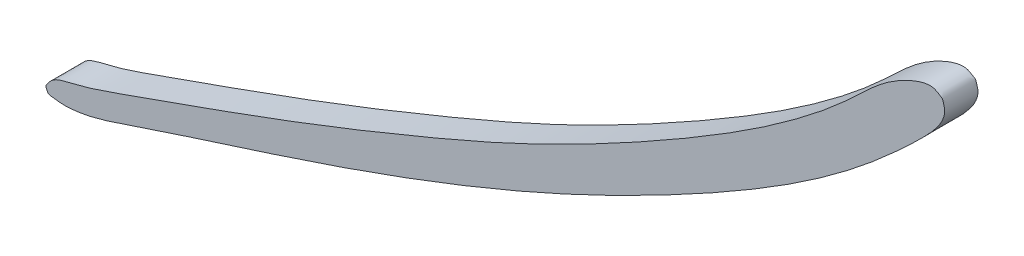
ISO-10303-21;
HEADER;
FILE_DESCRIPTION(('STEP AP214'),'2;1');
FILE_NAME('part.step','',(''),(''),'','','');
FILE_SCHEMA(('AUTOMOTIVE_DESIGN { 1 0 10303 214 1 1 1 1 }'));
ENDSEC;
DATA;
#1=APPLICATION_CONTEXT('core data for automotive mechanical design processes');
#2=APPLICATION_PROTOCOL_DEFINITION('international standard','automotive_design',2000,#1);
#3=PRODUCT_CONTEXT('',#1,'mechanical');
#4=PRODUCT('Part','Part','',(#3));
#5=PRODUCT_RELATED_PRODUCT_CATEGORY('part','',(#4));
#6=PRODUCT_DEFINITION_FORMATION('','',#4);
#7=PRODUCT_DEFINITION_CONTEXT('part definition',#1,'design');
#8=PRODUCT_DEFINITION('design','',#6,#7);
#9=PRODUCT_DEFINITION_SHAPE('','',#8);
#10=(LENGTH_UNIT() NAMED_UNIT(*) SI_UNIT(.MILLI.,.METRE.));
#11=(NAMED_UNIT(*) PLANE_ANGLE_UNIT() SI_UNIT($,.RADIAN.));
#12=(NAMED_UNIT(*) SI_UNIT($,.STERADIAN.) SOLID_ANGLE_UNIT());
#13=UNCERTAINTY_MEASURE_WITH_UNIT(LENGTH_MEASURE(1.E-05),#10,'distance_accuracy_value','');
#14=(GEOMETRIC_REPRESENTATION_CONTEXT(3) GLOBAL_UNCERTAINTY_ASSIGNED_CONTEXT((#13)) GLOBAL_UNIT_ASSIGNED_CONTEXT((#10,
#11,#12)) REPRESENTATION_CONTEXT('',''));
#15=CARTESIAN_POINT('',(0.,0.,0.));
#16=DIRECTION('',(0.,0.,1.));
#17=DIRECTION('',(1.,0.,0.));
#18=AXIS2_PLACEMENT_3D('',#15,#16,#17);
#19=CARTESIAN_POINT('',(101.888371417105,0.,148.));
#20=CARTESIAN_POINT('',(101.799799045957,0.136368437226454,148.));
#21=CARTESIAN_POINT('',(101.66803920609,0.231338491147924,148.));
#22=CARTESIAN_POINT('',(101.398117662418,0.404693908223681,148.));
#23=CARTESIAN_POINT('',(101.25798362386,0.482688788777403,148.));
#24=CARTESIAN_POINT('',(100.981235886567,0.644587099890132,148.));
#25=CARTESIAN_POINT('',(100.844389516816,0.728100014648792,148.));
#26=CARTESIAN_POINT('',(100.564828376442,0.885276300722039,148.));
#27=CARTESIAN_POINT('',(100.422310398472,0.958994361349454,148.));
#28=CARTESIAN_POINT('',(100.132781935363,1.09180106367416,148.));
#29=CARTESIAN_POINT('',(99.98541608821,1.15094079101418,148.));
#30=CARTESIAN_POINT('',(99.6807748753771,1.24155320108028,148.));
#31=CARTESIAN_POINT('',(99.5226184622509,1.27356356744469,148.));
#32=CARTESIAN_POINT('',(99.0425686585769,1.33364432656692,148.));
#33=CARTESIAN_POINT('',(98.7242209946714,1.3259051879344,148.));
#34=CARTESIAN_POINT('',(98.089199896991,1.26295457954378,148.));
#35=CARTESIAN_POINT('',(97.7717321772709,1.20640452707839,148.));
#36=CARTESIAN_POINT('',(97.1488247630582,1.07038752269426,148.));
#37=CARTESIAN_POINT('',(96.8415861500145,0.990306513611557,148.));
#38=CARTESIAN_POINT('',(95.9311932630367,0.717633268708795,148.));
#39=CARTESIAN_POINT('',(95.3386637582218,0.494610490534032,148.));
#40=CARTESIAN_POINT('',(94.1671047925024,0.00989927911138426,148.));
#41=CARTESIAN_POINT('',(93.5873369600567,-0.25465195661827,148.));
#42=CARTESIAN_POINT('',(92.4484867103512,-0.818530121022055,148.));
#43=CARTESIAN_POINT('',(91.8905289090881,-1.11650171079195,148.));
#44=CARTESIAN_POINT('',(90.2480067627484,-2.05424878921881,148.));
#45=CARTESIAN_POINT('',(89.1961616384529,-2.73976914159157,148.));
#46=CARTESIAN_POINT('',(86.1670137982674,-4.97303307612369,148.));
#47=CARTESIAN_POINT('',(84.3062127749,-6.683919778317,148.));
#48=CARTESIAN_POINT('',(81.542405258562,-9.28754672548957,148.));
#49=CARTESIAN_POINT('',(80.6244130923438,-10.1599084279702,148.));
#50=CARTESIAN_POINT('',(78.771375819199,-11.8812872295035,148.));
#51=CARTESIAN_POINT('',(77.8381557176031,-12.7328026674897,148.));
#52=CARTESIAN_POINT('',(75.002663341837,-15.2382967093921,148.));
#53=CARTESIAN_POINT('',(73.0627627879589,-16.840764123393,148.));
#54=CARTESIAN_POINT('',(69.1176683685773,-19.9563157480849,148.));
#55=CARTESIAN_POINT('',(67.1128431407002,-21.4699046048276,148.));
#56=CARTESIAN_POINT('',(63.0550004428135,-24.4311096042742,148.));
#57=CARTESIAN_POINT('',(61.0013758612816,-25.877894642363,148.));
#58=CARTESIAN_POINT('',(56.8445666721415,-28.7036195782568,148.));
#59=CARTESIAN_POINT('',(54.7419880418051,-30.0833890279459,148.));
#60=CARTESIAN_POINT('',(50.498873517519,-32.7909663752725,148.));
#61=CARTESIAN_POINT('',(48.3583555989382,-34.1187988802705,148.));
#62=CARTESIAN_POINT('',(44.0495362337347,-36.7364296617396,148.));
#63=CARTESIAN_POINT('',(41.8807430974184,-38.0263507461279,148.));
#64=CARTESIAN_POINT('',(35.3420200883168,-41.8464855475548,148.));
#65=CARTESIAN_POINT('',(30.943525837798,-44.3255191422492,148.));
#66=CARTESIAN_POINT('',(22.0846858980709,-49.1684321293682,148.));
#67=CARTESIAN_POINT('',(17.6260637175413,-51.5338473411045,148.));
#68=CARTESIAN_POINT('',(8.63293266619,-56.1190453860588,148.));
#69=CARTESIAN_POINT('',(4.09452709103804,-58.3345912146725,148.));
#70=CARTESIAN_POINT('',(-5.05520745141084,-62.5998491258625,148.));
#71=CARTESIAN_POINT('',(-9.66687703879908,-64.6508179006176,148.));
#72=CARTESIAN_POINT('',(-18.9381832250593,-68.6463220720038,148.));
#73=CARTESIAN_POINT('',(-23.5955758365268,-70.5954530360809,148.));
#74=CARTESIAN_POINT('',(-32.934001332736,-74.4324709870048,148.));
#75=CARTESIAN_POINT('',(-37.6157932292816,-76.3201473330144,148.));
#76=CARTESIAN_POINT('',(-47.0091881424765,-80.0224302759942,148.));
#77=CARTESIAN_POINT('',(-51.7210008038415,-81.8342091455159,148.));
#78=CARTESIAN_POINT('',(-65.8986062117116,-87.1566901109909,148.));
#79=CARTESIAN_POINT('',(-75.4070311050635,-90.5544630599219,148.));
#80=CARTESIAN_POINT('',(-87.2966135606502,-94.7875854443812,148.));
#81=CARTESIAN_POINT('',(-89.6751641888732,-95.632430907231,148.));
#82=CARTESIAN_POINT('',(-93.2458476410735,-96.891619804965,148.));
#83=CARTESIAN_POINT('',(-94.4365887766136,-97.3098951359232,148.));
#84=CARTESIAN_POINT('',(-96.8191869769639,-98.143240224408,148.));
#85=CARTESIAN_POINT('',(-98.0106684018685,-98.5594123879991,148.));
#86=CARTESIAN_POINT('',(-100.396398361942,-99.383750107259,148.));
#87=CARTESIAN_POINT('',(-101.591573173393,-99.7885272087427,148.));
#88=CARTESIAN_POINT('',(-104.001742367158,-100.534656231232,148.));
#89=CARTESIAN_POINT('',(-105.216694913536,-100.876492661037,148.));
#90=CARTESIAN_POINT('',(-107.672738404345,-101.474686874797,148.));
#91=CARTESIAN_POINT('',(-108.918464573326,-101.715625327886,148.));
#92=CARTESIAN_POINT('',(-110.417845309411,-102.206594525126,148.));
#93=CARTESIAN_POINT('',(-110.714865878804,-102.314168876814,148.));
#94=CARTESIAN_POINT('',(-111.297603157974,-102.566450517899,148.));
#95=CARTESIAN_POINT('',(-111.584669234586,-102.711438258266,148.));
#96=CARTESIAN_POINT('',(-111.996849818965,-102.974702996056,148.));
#97=CARTESIAN_POINT('',(-112.12856966779,-103.068501589364,148.));
#98=CARTESIAN_POINT('',(-112.378913616891,-103.27004854626,148.));
#99=CARTESIAN_POINT('',(-112.497203149214,-103.378153296204,148.));
#100=CARTESIAN_POINT('',(-112.724717643256,-103.604018500546,148.));
#101=CARTESIAN_POINT('',(-112.834167037557,-103.721539886293,148.));
#102=CARTESIAN_POINT('',(-113.044720787318,-103.965471907178,148.));
#103=CARTESIAN_POINT('',(-113.145516316446,-104.09230988869,148.));
#104=CARTESIAN_POINT('',(-113.345936509748,-104.34674650304,148.));
#105=CARTESIAN_POINT('',(-113.446646181976,-104.473629647736,148.));
#106=CARTESIAN_POINT('',(-113.582364443666,-104.674250076425,148.));
#107=CARTESIAN_POINT('',(-113.625447110609,-104.742570506681,148.));
#108=CARTESIAN_POINT('',(-113.69791467789,-104.88840112273,148.));
#109=CARTESIAN_POINT('',(-113.727296752749,-104.96744200211,148.));
#110=CARTESIAN_POINT('',(-113.755064888517,-105.128690470615,148.));
#111=CARTESIAN_POINT('',(-113.75316038359,-105.213073176671,148.));
#112=CARTESIAN_POINT('',(-113.728871560257,-105.375409328481,148.));
#113=CARTESIAN_POINT('',(-113.70669484361,-105.454829142798,148.));
#114=CARTESIAN_POINT('',(-113.624452239812,-105.688720040658,148.));
#115=CARTESIAN_POINT('',(-113.554986840441,-105.83752607616,148.));
#116=CARTESIAN_POINT('',(-113.399804940179,-106.127231619022,148.));
#117=CARTESIAN_POINT('',(-113.3121491482,-106.270258632243,148.));
#118=CARTESIAN_POINT('',(-113.128187775771,-106.43644257765,148.));
#119=CARTESIAN_POINT('',(-113.058759532885,-106.482847319085,148.));
#120=CARTESIAN_POINT('',(-112.90881994538,-106.551062159809,148.));
#121=CARTESIAN_POINT('',(-112.827585938327,-106.572216035898,148.));
#122=CARTESIAN_POINT('',(-112.586361256694,-106.615539621684,148.));
#123=CARTESIAN_POINT('',(-112.422872749499,-106.623135812894,148.));
#124=CARTESIAN_POINT('',(-112.097348096328,-106.64989804554,148.));
#125=CARTESIAN_POINT('',(-111.935133027168,-106.6674620581,148.));
#126=CARTESIAN_POINT('',(-111.44929447414,-106.727699874395,148.));
#127=CARTESIAN_POINT('',(-111.125713712255,-106.776961354061,148.));
#128=CARTESIAN_POINT('',(-110.478048169911,-106.860760473764,148.));
#129=CARTESIAN_POINT('',(-110.153840304209,-106.891702438034,148.));
#130=CARTESIAN_POINT('',(-109.179622463154,-106.937955856157,148.));
#131=CARTESIAN_POINT('',(-108.528379550797,-106.917249655811,148.));
#132=CARTESIAN_POINT('',(-107.2241319431,-106.82437048097,148.));
#133=CARTESIAN_POINT('',(-106.572734453844,-106.753540777278,148.));
#134=CARTESIAN_POINT('',(-105.284789758596,-106.571424601535,148.));
#135=CARTESIAN_POINT('',(-104.646188265237,-106.459574994132,148.));
#136=CARTESIAN_POINT('',(-102.744300423096,-106.070152423867,148.));
#137=CARTESIAN_POINT('',(-101.494494528344,-105.740394257417,148.));
#138=CARTESIAN_POINT('',(-99.0100975998629,-105.021978527033,148.));
#139=CARTESIAN_POINT('',(-97.7756356088877,-104.632821415952,148.));
#140=CARTESIAN_POINT('',(-95.3129598720776,-103.830319140184,148.));
#141=CARTESIAN_POINT('',(-94.084283112039,-103.418447448534,148.));
#142=CARTESIAN_POINT('',(-91.6285731673388,-102.590018700838,148.));
#143=CARTESIAN_POINT('',(-90.4014687175601,-102.17357773108,148.));
#144=CARTESIAN_POINT('',(-87.9454047619098,-101.346199237386,148.));
#145=CARTESIAN_POINT('',(-86.7167482254082,-100.934345389862,148.));
#146=CARTESIAN_POINT('',(-80.5686305866322,-98.8897524387817,148.));
#147=CARTESIAN_POINT('',(-75.6331342654816,-97.3057443496474,148.));
#148=CARTESIAN_POINT('',(-65.7620780941067,-94.1386867008722,148.));
#149=CARTESIAN_POINT('',(-60.8267764724534,-92.5543907184505,148.));
#150=CARTESIAN_POINT('',(-50.978404390806,-89.3188574276455,148.));
#151=CARTESIAN_POINT('',(-46.0653451579945,-87.6675569766903,148.));
#152=CARTESIAN_POINT('',(-36.2715501627446,-84.2675400890708,148.));
#153=CARTESIAN_POINT('',(-31.3922872084863,-82.5193835343112,148.));
#154=CARTESIAN_POINT('',(-21.6763877885582,-78.9084230007996,148.));
#155=CARTESIAN_POINT('',(-16.8389190410296,-77.0450872904366,148.));
#156=CARTESIAN_POINT('',(-7.21727301074776,-73.1864488150498,148.));
#157=CARTESIAN_POINT('',(-2.43353276957538,-71.1934971533681,148.));
#158=CARTESIAN_POINT('',(7.06937323789851,-67.0558726522328,148.));
#159=CARTESIAN_POINT('',(11.7898595271621,-64.9105889003481,148.));
#160=CARTESIAN_POINT('',(21.1581893193928,-60.4745375628304,148.));
#161=CARTESIAN_POINT('',(25.8068710474123,-58.1844857734696,148.));
#162=CARTESIAN_POINT('',(35.0359586592203,-53.465791295043,148.));
#163=CARTESIAN_POINT('',(39.6176804740266,-51.0382185033996,148.));
#164=CARTESIAN_POINT('',(48.6947074205838,-46.036267864575,148.));
#165=CARTESIAN_POINT('',(53.1919158559889,-43.462372662366,148.));
#166=CARTESIAN_POINT('',(62.0669864246018,-38.1038883858074,148.));
#167=CARTESIAN_POINT('',(66.4410637306971,-35.3190549255764,148.));
#168=CARTESIAN_POINT('',(72.84124813514,-30.9079229683238,148.));
#169=CARTESIAN_POINT('',(74.9492353560478,-29.3972638640898,148.));
#170=CARTESIAN_POINT('',(79.0999619374198,-26.2901377306652,148.));
#171=CARTESIAN_POINT('',(81.1419704062107,-24.6942257788889,148.));
#172=CARTESIAN_POINT('',(85.1559086543716,-21.4134266029437,148.));
#173=CARTESIAN_POINT('',(87.1279245936258,-19.7281365704364,148.));
#174=CARTESIAN_POINT('',(91.0006692023807,-16.2803099955086,148.));
#175=CARTESIAN_POINT('',(92.9038318327586,-14.5182606252907,148.));
#176=CARTESIAN_POINT('',(95.7122247874232,-11.8274536723677,148.));
#177=CARTESIAN_POINT('',(96.640798767926,-10.9220905067733,148.));
#178=CARTESIAN_POINT('',(98.0041067907404,-9.53558556151971,148.));
#179=CARTESIAN_POINT('',(98.4524255947621,-9.06749146593588,148.));
#180=CARTESIAN_POINT('',(99.3275686716807,-8.11048136298256,148.));
#181=CARTESIAN_POINT('',(99.755298275638,-7.62321193670186,148.));
#182=CARTESIAN_POINT('',(100.56348199834,-6.61495815998524,148.));
#183=CARTESIAN_POINT('',(100.944088958858,-6.09345438291395,148.));
#184=CARTESIAN_POINT('',(101.453400208446,-5.26562039881121,148.));
#185=CARTESIAN_POINT('',(101.613290451751,-4.98042917933537,148.));
#186=CARTESIAN_POINT('',(101.900060746814,-4.39649226255193,148.));
#187=CARTESIAN_POINT('',(102.026483312105,-4.09809898036491,148.));
#188=CARTESIAN_POINT('',(102.241885450584,-3.48713034021816,148.));
#189=CARTESIAN_POINT('',(102.331980896213,-3.17229692312702,148.));
#190=CARTESIAN_POINT('',(102.444106653083,-2.52932712801889,148.));
#191=CARTESIAN_POINT('',(102.467507585277,-2.20546188063999,148.));
#192=CARTESIAN_POINT('',(102.390542665347,-1.55085309519455,148.));
#193=CARTESIAN_POINT('',(102.286546854353,-1.24081077180162,148.));
#194=CARTESIAN_POINT('',(102.137803460265,-0.773836904079968,148.));
#195=CARTESIAN_POINT('',(102.094937348805,-0.616405459453231,148.));
#196=CARTESIAN_POINT('',(102.03369617341,-0.379465354325082,148.));
#197=CARTESIAN_POINT('',(102.013959292889,-0.300243804954098,148.));
#198=CARTESIAN_POINT('',(101.964240715685,-0.145456301387804,148.));
#199=CARTESIAN_POINT('',(101.932657602679,-0.0681842186132123,148.));
#200=CARTESIAN_POINT('',(101.888371417105,0.,148.));
#201=B_SPLINE_CURVE_WITH_KNOTS('',3,(#19,#20,#21,#22,#23,#24,#25,#26,#27,#28,#29,#30,#31,#32,
#33,#34,#35,#36,#37,#38,#39,#40,#41,#42,#43,#44,#45,#46,#47,#48,#49,#50,#51,#52,#53,#54,#55,#56,
#57,#58,#59,#60,#61,#62,#63,#64,#65,#66,#67,#68,#69,#70,#71,#72,#73,#74,#75,#76,#77,#78,#79,#80,
#81,#82,#83,#84,#85,#86,#87,#88,#89,#90,#91,#92,#93,#94,#95,#96,#97,#98,#99,#100,#101,#102,#103,
#104,#105,#106,#107,#108,#109,#110,#111,#112,#113,#114,#115,#116,#117,#118,#119,#120,#121,#122,
#123,#124,#125,#126,#127,#128,#129,#130,#131,#132,#133,#134,#135,#136,#137,#138,#139,#140,#141,
#142,#143,#144,#145,#146,#147,#148,#149,#150,#151,#152,#153,#154,#155,#156,#157,#158,#159,#160,
#161,#162,#163,#164,#165,#166,#167,#168,#169,#170,#171,#172,#173,#174,#175,#176,#177,#178,#179,
#180,#181,#182,#183,#184,#185,#186,#187,#188,#189,#190,#191,#192,#193,#194,#195,#196,#197,#198,
#199,#200),.UNSPECIFIED.,.T.,.F.,(4,2,2,2,2,2,2,2,2,2,2,2,2,2,2,2,2,2,2,2,2,2,2,2,2,2,2,2,2,2,2,
2,2,2,2,2,2,2,2,2,2,2,2,2,2,2,2,2,2,2,2,2,2,2,2,2,2,2,2,2,2,2,2,2,2,2,2,2,2,2,2,2,2,2,2,2,2,2,2,
2,2,2,2,2,2,2,2,2,2,2,4),(0.,0.000976562499999869,0.00195312499999974,0.00292968749999961,
0.00390624999999948,0.00488281249999935,0.00585937499999921,0.00781249999999895,
0.00976562499999869,0.0117187499999984,0.0156249999999979,0.0195312499999974,0.0234374999999969,
0.0312499999999959,0.0468749999999939,0.054687499999993,0.062499999999992,0.07812499999999,
0.0937499999999881,0.109374999999986,0.124999999999984,0.140624999999982,0.15624999999998,
0.187499999999976,0.218749999999972,0.249999999999968,0.281249999999964,0.31249999999996,
0.343749999999956,0.374999999999952,0.437499999999944,0.453124999999942,0.460937499999941,
0.46874999999994,0.47656249999994,0.484374999999939,0.492187499999938,0.494140624999937,
0.496093749999937,0.497070312499937,0.498046874999937,0.499023437499937,0.499999999999936,
0.500976562499936,0.501464843749936,0.501953124999936,0.502441406249936,0.502929687499936,
0.503906249999936,0.504882812499936,0.505371093749936,0.505859374999936,0.506835937499936,
0.507812499999936,0.509765624999936,0.511718749999937,0.515624999999937,0.519531249999938,
0.523437499999938,0.531249999999939,0.53906249999994,0.546874999999941,0.554687499999942,
0.562499999999943,0.593749999999947,0.624999999999951,0.656249999999955,0.687499999999959,
0.718749999999964,0.749999999999968,0.781249999999972,0.812499999999976,0.84374999999998,
0.874999999999984,0.906249999999988,0.92187499999999,0.937499999999992,0.953124999999994,
0.968749999999996,0.976562499999997,0.980468749999997,0.984374999999998,0.988281249999998,
0.990234374999999,0.992187499999999,0.994140624999999,0.996093749999999,0.998046875,
0.9990234375,0.99951171875,1.),.UNSPECIFIED.);
#202=DIRECTION('',(0.,0.,-1.));
#203=VECTOR('',#202,1.);
#204=SURFACE_OF_LINEAR_EXTRUSION('',#201,#203);
#205=CARTESIAN_POINT('',(101.888371417105,0.,148.));
#206=CARTESIAN_POINT('',(101.932657602679,-0.0681842186132123,148.));
#207=CARTESIAN_POINT('',(101.964240715685,-0.145456301387804,148.));
#208=CARTESIAN_POINT('',(102.013959292889,-0.300243804954098,148.));
#209=CARTESIAN_POINT('',(102.03369617341,-0.379465354325082,148.));
#210=CARTESIAN_POINT('',(102.094937348805,-0.616405459453231,148.));
#211=CARTESIAN_POINT('',(102.137803460265,-0.773836904079968,148.));
#212=CARTESIAN_POINT('',(102.286546854353,-1.24081077180162,148.));
#213=CARTESIAN_POINT('',(102.390542665347,-1.55085309519455,148.));
#214=CARTESIAN_POINT('',(102.467507585277,-2.20546188063999,148.));
#215=CARTESIAN_POINT('',(102.444106653083,-2.52932712801889,148.));
#216=CARTESIAN_POINT('',(102.331980896213,-3.17229692312702,148.));
#217=CARTESIAN_POINT('',(102.241885450584,-3.48713034021816,148.));
#218=CARTESIAN_POINT('',(102.026483312105,-4.09809898036491,148.));
#219=CARTESIAN_POINT('',(101.900060746814,-4.39649226255193,148.));
#220=CARTESIAN_POINT('',(101.613290451751,-4.98042917933537,148.));
#221=CARTESIAN_POINT('',(101.453400208446,-5.26562039881121,148.));
#222=CARTESIAN_POINT('',(100.944088958858,-6.09345438291395,148.));
#223=CARTESIAN_POINT('',(100.56348199834,-6.61495815998524,148.));
#224=CARTESIAN_POINT('',(99.755298275638,-7.62321193670186,148.));
#225=CARTESIAN_POINT('',(99.3275686716807,-8.11048136298256,148.));
#226=CARTESIAN_POINT('',(98.4524255947621,-9.06749146593588,148.));
#227=CARTESIAN_POINT('',(98.0041067907404,-9.53558556151971,148.));
#228=CARTESIAN_POINT('',(96.640798767926,-10.9220905067733,148.));
#229=CARTESIAN_POINT('',(95.7122247874232,-11.8274536723677,148.));
#230=CARTESIAN_POINT('',(92.9038318327586,-14.5182606252907,148.));
#231=CARTESIAN_POINT('',(91.0006692023807,-16.2803099955086,148.));
#232=CARTESIAN_POINT('',(87.1279245936258,-19.7281365704364,148.));
#233=CARTESIAN_POINT('',(85.1559086543716,-21.4134266029437,148.));
#234=CARTESIAN_POINT('',(81.1419704062107,-24.6942257788889,148.));
#235=CARTESIAN_POINT('',(79.0999619374198,-26.2901377306652,148.));
#236=CARTESIAN_POINT('',(74.9492353560478,-29.3972638640898,148.));
#237=CARTESIAN_POINT('',(72.84124813514,-30.9079229683238,148.));
#238=CARTESIAN_POINT('',(66.4410637306971,-35.3190549255764,148.));
#239=CARTESIAN_POINT('',(62.0669864246018,-38.1038883858074,148.));
#240=CARTESIAN_POINT('',(53.1919158559889,-43.462372662366,148.));
#241=CARTESIAN_POINT('',(48.6947074205838,-46.036267864575,148.));
#242=CARTESIAN_POINT('',(39.6176804740266,-51.0382185033996,148.));
#243=CARTESIAN_POINT('',(35.0359586592203,-53.465791295043,148.));
#244=CARTESIAN_POINT('',(25.8068710474123,-58.1844857734696,148.));
#245=CARTESIAN_POINT('',(21.1581893193928,-60.4745375628304,148.));
#246=CARTESIAN_POINT('',(11.7898595271621,-64.9105889003481,148.));
#247=CARTESIAN_POINT('',(7.06937323789851,-67.0558726522328,148.));
#248=CARTESIAN_POINT('',(-2.43353276957538,-71.1934971533681,148.));
#249=CARTESIAN_POINT('',(-7.21727301074776,-73.1864488150498,148.));
#250=CARTESIAN_POINT('',(-16.8389190410296,-77.0450872904366,148.));
#251=CARTESIAN_POINT('',(-21.6763877885582,-78.9084230007996,148.));
#252=CARTESIAN_POINT('',(-31.3922872084863,-82.5193835343112,148.));
#253=CARTESIAN_POINT('',(-36.2715501627446,-84.2675400890708,148.));
#254=CARTESIAN_POINT('',(-46.0653451579945,-87.6675569766903,148.));
#255=CARTESIAN_POINT('',(-50.978404390806,-89.3188574276455,148.));
#256=CARTESIAN_POINT('',(-60.8267764724534,-92.5543907184505,148.));
#257=CARTESIAN_POINT('',(-65.7620780941067,-94.1386867008722,148.));
#258=CARTESIAN_POINT('',(-75.6331342654816,-97.3057443496474,148.));
#259=CARTESIAN_POINT('',(-80.5686305866322,-98.8897524387817,148.));
#260=CARTESIAN_POINT('',(-86.7167482254082,-100.934345389862,148.));
#261=CARTESIAN_POINT('',(-87.9454047619098,-101.346199237386,148.));
#262=CARTESIAN_POINT('',(-90.4014687175601,-102.17357773108,148.));
#263=CARTESIAN_POINT('',(-91.6285731673388,-102.590018700838,148.));
#264=CARTESIAN_POINT('',(-94.084283112039,-103.418447448534,148.));
#265=CARTESIAN_POINT('',(-95.3129598720776,-103.830319140184,148.));
#266=CARTESIAN_POINT('',(-97.7756356088877,-104.632821415952,148.));
#267=CARTESIAN_POINT('',(-99.0100975998629,-105.021978527033,148.));
#268=CARTESIAN_POINT('',(-101.494494528344,-105.740394257417,148.));
#269=CARTESIAN_POINT('',(-102.744300423096,-106.070152423867,148.));
#270=CARTESIAN_POINT('',(-104.646188265237,-106.459574994132,148.));
#271=CARTESIAN_POINT('',(-105.284789758596,-106.571424601535,148.));
#272=CARTESIAN_POINT('',(-106.572734453844,-106.753540777278,148.));
#273=CARTESIAN_POINT('',(-107.2241319431,-106.82437048097,148.));
#274=CARTESIAN_POINT('',(-108.528379550797,-106.917249655811,148.));
#275=CARTESIAN_POINT('',(-109.179622463154,-106.937955856157,148.));
#276=CARTESIAN_POINT('',(-110.153840304209,-106.891702438034,148.));
#277=CARTESIAN_POINT('',(-110.478048169911,-106.860760473764,148.));
#278=CARTESIAN_POINT('',(-111.125713712255,-106.776961354061,148.));
#279=CARTESIAN_POINT('',(-111.44929447414,-106.727699874395,148.));
#280=CARTESIAN_POINT('',(-111.935133027168,-106.6674620581,148.));
#281=CARTESIAN_POINT('',(-112.097348096328,-106.64989804554,148.));
#282=CARTESIAN_POINT('',(-112.422872749499,-106.623135812894,148.));
#283=CARTESIAN_POINT('',(-112.586361256694,-106.615539621684,148.));
#284=CARTESIAN_POINT('',(-112.827585938327,-106.572216035898,148.));
#285=CARTESIAN_POINT('',(-112.90881994538,-106.551062159809,148.));
#286=CARTESIAN_POINT('',(-113.058759532885,-106.482847319085,148.));
#287=CARTESIAN_POINT('',(-113.128187775771,-106.43644257765,148.));
#288=CARTESIAN_POINT('',(-113.3121491482,-106.270258632243,148.));
#289=CARTESIAN_POINT('',(-113.399804940179,-106.127231619022,148.));
#290=CARTESIAN_POINT('',(-113.554986840441,-105.83752607616,148.));
#291=CARTESIAN_POINT('',(-113.624452239812,-105.688720040658,148.));
#292=CARTESIAN_POINT('',(-113.70669484361,-105.454829142798,148.));
#293=CARTESIAN_POINT('',(-113.728871560257,-105.375409328481,148.));
#294=CARTESIAN_POINT('',(-113.75316038359,-105.213073176671,148.));
#295=CARTESIAN_POINT('',(-113.755064888517,-105.128690470615,148.));
#296=CARTESIAN_POINT('',(-113.727296752749,-104.96744200211,148.));
#297=CARTESIAN_POINT('',(-113.69791467789,-104.88840112273,148.));
#298=CARTESIAN_POINT('',(-113.625447110609,-104.742570506681,148.));
#299=CARTESIAN_POINT('',(-113.582364443666,-104.674250076425,148.));
#300=CARTESIAN_POINT('',(-113.446646181976,-104.473629647736,148.));
#301=CARTESIAN_POINT('',(-113.345936509748,-104.34674650304,148.));
#302=CARTESIAN_POINT('',(-113.145516316446,-104.09230988869,148.));
#303=CARTESIAN_POINT('',(-113.044720787318,-103.965471907178,148.));
#304=CARTESIAN_POINT('',(-112.834167037557,-103.721539886293,148.));
#305=CARTESIAN_POINT('',(-112.724717643256,-103.604018500546,148.));
#306=CARTESIAN_POINT('',(-112.497203149214,-103.378153296204,148.));
#307=CARTESIAN_POINT('',(-112.378913616891,-103.27004854626,148.));
#308=CARTESIAN_POINT('',(-112.12856966779,-103.068501589364,148.));
#309=CARTESIAN_POINT('',(-111.996849818965,-102.974702996056,148.));
#310=CARTESIAN_POINT('',(-111.584669234586,-102.711438258266,148.));
#311=CARTESIAN_POINT('',(-111.297603157974,-102.566450517899,148.));
#312=CARTESIAN_POINT('',(-110.714865878804,-102.314168876814,148.));
#313=CARTESIAN_POINT('',(-110.417845309411,-102.206594525126,148.));
#314=CARTESIAN_POINT('',(-108.918464573326,-101.715625327886,148.));
#315=CARTESIAN_POINT('',(-107.672738404345,-101.474686874797,148.));
#316=CARTESIAN_POINT('',(-105.216694913536,-100.876492661037,148.));
#317=CARTESIAN_POINT('',(-104.001742367158,-100.534656231232,148.));
#318=CARTESIAN_POINT('',(-101.591573173393,-99.7885272087427,148.));
#319=CARTESIAN_POINT('',(-100.396398361942,-99.383750107259,148.));
#320=CARTESIAN_POINT('',(-98.0106684018685,-98.5594123879991,148.));
#321=CARTESIAN_POINT('',(-96.8191869769639,-98.143240224408,148.));
#322=CARTESIAN_POINT('',(-94.4365887766136,-97.3098951359232,148.));
#323=CARTESIAN_POINT('',(-93.2458476410735,-96.891619804965,148.));
#324=CARTESIAN_POINT('',(-89.6751641888732,-95.632430907231,148.));
#325=CARTESIAN_POINT('',(-87.2966135606502,-94.7875854443812,148.));
#326=CARTESIAN_POINT('',(-75.4070311050635,-90.5544630599219,148.));
#327=CARTESIAN_POINT('',(-65.8986062117116,-87.1566901109909,148.));
#328=CARTESIAN_POINT('',(-51.7210008038415,-81.8342091455159,148.));
#329=CARTESIAN_POINT('',(-47.0091881424765,-80.0224302759942,148.));
#330=CARTESIAN_POINT('',(-37.6157932292816,-76.3201473330144,148.));
#331=CARTESIAN_POINT('',(-32.934001332736,-74.4324709870048,148.));
#332=CARTESIAN_POINT('',(-23.5955758365268,-70.5954530360809,148.));
#333=CARTESIAN_POINT('',(-18.9381832250593,-68.6463220720038,148.));
#334=CARTESIAN_POINT('',(-9.66687703879908,-64.6508179006176,148.));
#335=CARTESIAN_POINT('',(-5.05520745141084,-62.5998491258625,148.));
#336=CARTESIAN_POINT('',(4.09452709103804,-58.3345912146725,148.));
#337=CARTESIAN_POINT('',(8.63293266619,-56.1190453860588,148.));
#338=CARTESIAN_POINT('',(17.6260637175413,-51.5338473411045,148.));
#339=CARTESIAN_POINT('',(22.0846858980709,-49.1684321293682,148.));
#340=CARTESIAN_POINT('',(30.943525837798,-44.3255191422492,148.));
#341=CARTESIAN_POINT('',(35.3420200883168,-41.8464855475548,148.));
#342=CARTESIAN_POINT('',(41.8807430974184,-38.0263507461279,148.));
#343=CARTESIAN_POINT('',(44.0495362337347,-36.7364296617396,148.));
#344=CARTESIAN_POINT('',(48.3583555989382,-34.1187988802705,148.));
#345=CARTESIAN_POINT('',(50.498873517519,-32.7909663752725,148.));
#346=CARTESIAN_POINT('',(54.7419880418051,-30.0833890279459,148.));
#347=CARTESIAN_POINT('',(56.8445666721415,-28.7036195782568,148.));
#348=CARTESIAN_POINT('',(61.0013758612816,-25.877894642363,148.));
#349=CARTESIAN_POINT('',(63.0550004428135,-24.4311096042742,148.));
#350=CARTESIAN_POINT('',(67.1128431407002,-21.4699046048276,148.));
#351=CARTESIAN_POINT('',(69.1176683685773,-19.9563157480849,148.));
#352=CARTESIAN_POINT('',(73.0627627879589,-16.840764123393,148.));
#353=CARTESIAN_POINT('',(75.002663341837,-15.2382967093921,148.));
#354=CARTESIAN_POINT('',(77.8381557176031,-12.7328026674897,148.));
#355=CARTESIAN_POINT('',(78.771375819199,-11.8812872295035,148.));
#356=CARTESIAN_POINT('',(80.6244130923438,-10.1599084279702,148.));
#357=CARTESIAN_POINT('',(81.542405258562,-9.28754672548957,148.));
#358=CARTESIAN_POINT('',(84.3062127749,-6.683919778317,148.));
#359=CARTESIAN_POINT('',(86.1670137982674,-4.97303307612369,148.));
#360=CARTESIAN_POINT('',(89.1961616384529,-2.73976914159157,148.));
#361=CARTESIAN_POINT('',(90.2480067627484,-2.05424878921881,148.));
#362=CARTESIAN_POINT('',(91.8905289090881,-1.11650171079195,148.));
#363=CARTESIAN_POINT('',(92.4484867103512,-0.818530121022055,148.));
#364=CARTESIAN_POINT('',(93.5873369600567,-0.25465195661827,148.));
#365=CARTESIAN_POINT('',(94.1671047925024,0.00989927911138426,148.));
#366=CARTESIAN_POINT('',(95.3386637582218,0.494610490534032,148.));
#367=CARTESIAN_POINT('',(95.9311932630367,0.717633268708795,148.));
#368=CARTESIAN_POINT('',(96.8415861500145,0.990306513611557,148.));
#369=CARTESIAN_POINT('',(97.1488247630582,1.07038752269426,148.));
#370=CARTESIAN_POINT('',(97.7717321772709,1.20640452707839,148.));
#371=CARTESIAN_POINT('',(98.089199896991,1.26295457954378,148.));
#372=CARTESIAN_POINT('',(98.7242209946714,1.3259051879344,148.));
#373=CARTESIAN_POINT('',(99.0425686585769,1.33364432656692,148.));
#374=CARTESIAN_POINT('',(99.5226184622509,1.27356356744469,148.));
#375=CARTESIAN_POINT('',(99.6807748753771,1.24155320108028,148.));
#376=CARTESIAN_POINT('',(99.98541608821,1.15094079101418,148.));
#377=CARTESIAN_POINT('',(100.132781935363,1.09180106367416,148.));
#378=CARTESIAN_POINT('',(100.422310398472,0.958994361349454,148.));
#379=CARTESIAN_POINT('',(100.564828376442,0.885276300722039,148.));
#380=CARTESIAN_POINT('',(100.844389516816,0.728100014648792,148.));
#381=CARTESIAN_POINT('',(100.981235886567,0.644587099890132,148.));
#382=CARTESIAN_POINT('',(101.25798362386,0.482688788777403,148.));
#383=CARTESIAN_POINT('',(101.398117662418,0.404693908223681,148.));
#384=CARTESIAN_POINT('',(101.66803920609,0.231338491147924,148.));
#385=CARTESIAN_POINT('',(101.799799045957,0.136368437226454,148.));
#386=CARTESIAN_POINT('',(101.888371417105,0.,148.));
#387=B_SPLINE_CURVE_WITH_KNOTS('',3,(#205,#206,#207,#208,#209,#210,#211,#212,#213,#214,#215,
#216,#217,#218,#219,#220,#221,#222,#223,#224,#225,#226,#227,#228,#229,#230,#231,#232,#233,#234,
#235,#236,#237,#238,#239,#240,#241,#242,#243,#244,#245,#246,#247,#248,#249,#250,#251,#252,#253,
#254,#255,#256,#257,#258,#259,#260,#261,#262,#263,#264,#265,#266,#267,#268,#269,#270,#271,#272,
#273,#274,#275,#276,#277,#278,#279,#280,#281,#282,#283,#284,#285,#286,#287,#288,#289,#290,#291,
#292,#293,#294,#295,#296,#297,#298,#299,#300,#301,#302,#303,#304,#305,#306,#307,#308,#309,#310,
#311,#312,#313,#314,#315,#316,#317,#318,#319,#320,#321,#322,#323,#324,#325,#326,#327,#328,#329,
#330,#331,#332,#333,#334,#335,#336,#337,#338,#339,#340,#341,#342,#343,#344,#345,#346,#347,#348,
#349,#350,#351,#352,#353,#354,#355,#356,#357,#358,#359,#360,#361,#362,#363,#364,#365,#366,#367,
#368,#369,#370,#371,#372,#373,#374,#375,#376,#377,#378,#379,#380,#381,#382,#383,#384,#385,#386),
.UNSPECIFIED.,.T.,.F.,(4,2,2,2,2,2,2,2,2,2,2,2,2,2,2,2,2,2,2,2,2,2,2,2,2,2,2,2,2,2,2,2,2,2,2,2,
2,2,2,2,2,2,2,2,2,2,2,2,2,2,2,2,2,2,2,2,2,2,2,2,2,2,2,2,2,2,2,2,2,2,2,2,2,2,2,2,2,2,2,2,2,2,2,2,
2,2,2,2,2,2,4),(0.,0.000488281250000111,0.000976562500000222,0.00195312500000033,
0.00390625000000056,0.00585937500000089,0.00781250000000122,0.00976562500000144,
0.0117187500000018,0.0156250000000022,0.0195312500000027,0.0234375000000032,0.0312500000000042,
0.0468750000000062,0.0625000000000083,0.0781250000000103,0.0937500000000123,0.125000000000016,
0.15625000000002,0.187500000000024,0.218750000000028,0.250000000000032,0.281250000000036,
0.312500000000041,0.343750000000045,0.375000000000049,0.406250000000053,0.437500000000057,
0.445312500000058,0.453125000000059,0.46093750000006,0.468750000000061,0.476562500000062,
0.480468750000062,0.484375000000063,0.488281250000063,0.490234375000064,0.492187500000064,
0.493164062500064,0.494140625000064,0.494628906250064,0.495117187500064,0.496093750000064,
0.497070312500064,0.497558593750064,0.498046875000064,0.498535156250064,0.499023437500064,
0.500000000000064,0.500976562500063,0.501953125000063,0.502929687500063,0.503906250000063,
0.505859375000063,0.507812500000062,0.515625000000062,0.52343750000006,0.53125000000006,
0.539062500000059,0.546875000000058,0.562500000000056,0.625000000000048,0.656250000000044,
0.68750000000004,0.718750000000036,0.750000000000032,0.781250000000028,0.812500000000024,
0.84375000000002,0.859375000000018,0.875000000000016,0.890625000000014,0.906250000000012,
0.92187500000001,0.937500000000008,0.945312500000007,0.953125000000006,0.968750000000004,
0.976562500000003,0.980468750000003,0.984375000000002,0.988281250000002,0.990234375000001,
0.992187500000001,0.994140625000001,0.995117187500001,0.996093750000001,0.9970703125,
0.998046875,0.9990234375,1.),.UNSPECIFIED.);
#388=CARTESIAN_POINT('',(101.888371417105,0.,148.));
#389=VERTEX_POINT('',#388);
#390=EDGE_CURVE('E10',#389,#389,#387,.F.);
#391=ORIENTED_EDGE('',*,*,#390,.F.);
#392=EDGE_LOOP('',(#391));
#393=FACE_BOUND('',#392,.T.);
#394=CARTESIAN_POINT('',(101.888371417105,0.,140.));
#395=CARTESIAN_POINT('',(101.799799045957,0.136368437226454,140.));
#396=CARTESIAN_POINT('',(101.66803920609,0.231338491147924,140.));
#397=CARTESIAN_POINT('',(101.398117662418,0.404693908223681,140.));
#398=CARTESIAN_POINT('',(101.25798362386,0.482688788777403,140.));
#399=CARTESIAN_POINT('',(100.981235886567,0.644587099890132,140.));
#400=CARTESIAN_POINT('',(100.844389516816,0.728100014648792,140.));
#401=CARTESIAN_POINT('',(100.564828376442,0.885276300722039,140.));
#402=CARTESIAN_POINT('',(100.422310398472,0.958994361349454,140.));
#403=CARTESIAN_POINT('',(100.132781935363,1.09180106367416,140.));
#404=CARTESIAN_POINT('',(99.98541608821,1.15094079101418,140.));
#405=CARTESIAN_POINT('',(99.6807748753771,1.24155320108028,140.));
#406=CARTESIAN_POINT('',(99.5226184622509,1.27356356744469,140.));
#407=CARTESIAN_POINT('',(99.0425686585769,1.33364432656692,140.));
#408=CARTESIAN_POINT('',(98.7242209946714,1.3259051879344,140.));
#409=CARTESIAN_POINT('',(98.089199896991,1.26295457954378,140.));
#410=CARTESIAN_POINT('',(97.7717321772709,1.20640452707839,140.));
#411=CARTESIAN_POINT('',(97.1488247630582,1.07038752269426,140.));
#412=CARTESIAN_POINT('',(96.8415861500145,0.990306513611557,140.));
#413=CARTESIAN_POINT('',(95.9311932630367,0.717633268708795,140.));
#414=CARTESIAN_POINT('',(95.3386637582218,0.494610490534032,140.));
#415=CARTESIAN_POINT('',(94.1671047925024,0.00989927911138426,140.));
#416=CARTESIAN_POINT('',(93.5873369600567,-0.25465195661827,140.));
#417=CARTESIAN_POINT('',(92.4484867103512,-0.818530121022055,140.));
#418=CARTESIAN_POINT('',(91.8905289090881,-1.11650171079195,140.));
#419=CARTESIAN_POINT('',(90.2480067627484,-2.05424878921881,140.));
#420=CARTESIAN_POINT('',(89.1961616384529,-2.73976914159157,140.));
#421=CARTESIAN_POINT('',(86.1670137982674,-4.97303307612369,140.));
#422=CARTESIAN_POINT('',(84.3062127749,-6.683919778317,140.));
#423=CARTESIAN_POINT('',(81.542405258562,-9.28754672548957,140.));
#424=CARTESIAN_POINT('',(80.6244130923438,-10.1599084279702,140.));
#425=CARTESIAN_POINT('',(78.771375819199,-11.8812872295035,140.));
#426=CARTESIAN_POINT('',(77.8381557176031,-12.7328026674897,140.));
#427=CARTESIAN_POINT('',(75.002663341837,-15.2382967093921,140.));
#428=CARTESIAN_POINT('',(73.0627627879589,-16.840764123393,140.));
#429=CARTESIAN_POINT('',(69.1176683685773,-19.9563157480849,140.));
#430=CARTESIAN_POINT('',(67.1128431407002,-21.4699046048276,140.));
#431=CARTESIAN_POINT('',(63.0550004428135,-24.4311096042742,140.));
#432=CARTESIAN_POINT('',(61.0013758612816,-25.877894642363,140.));
#433=CARTESIAN_POINT('',(56.8445666721415,-28.7036195782568,140.));
#434=CARTESIAN_POINT('',(54.7419880418051,-30.0833890279459,140.));
#435=CARTESIAN_POINT('',(50.498873517519,-32.7909663752725,140.));
#436=CARTESIAN_POINT('',(48.3583555989382,-34.1187988802705,140.));
#437=CARTESIAN_POINT('',(44.0495362337347,-36.7364296617396,140.));
#438=CARTESIAN_POINT('',(41.8807430974184,-38.0263507461279,140.));
#439=CARTESIAN_POINT('',(35.3420200883168,-41.8464855475548,140.));
#440=CARTESIAN_POINT('',(30.943525837798,-44.3255191422492,140.));
#441=CARTESIAN_POINT('',(22.0846858980709,-49.1684321293682,140.));
#442=CARTESIAN_POINT('',(17.6260637175413,-51.5338473411045,140.));
#443=CARTESIAN_POINT('',(8.63293266619,-56.1190453860588,140.));
#444=CARTESIAN_POINT('',(4.09452709103804,-58.3345912146725,140.));
#445=CARTESIAN_POINT('',(-5.05520745141084,-62.5998491258625,140.));
#446=CARTESIAN_POINT('',(-9.66687703879908,-64.6508179006176,140.));
#447=CARTESIAN_POINT('',(-18.9381832250593,-68.6463220720038,140.));
#448=CARTESIAN_POINT('',(-23.5955758365268,-70.5954530360809,140.));
#449=CARTESIAN_POINT('',(-32.934001332736,-74.4324709870048,140.));
#450=CARTESIAN_POINT('',(-37.6157932292816,-76.3201473330144,140.));
#451=CARTESIAN_POINT('',(-47.0091881424765,-80.0224302759942,140.));
#452=CARTESIAN_POINT('',(-51.7210008038415,-81.8342091455159,140.));
#453=CARTESIAN_POINT('',(-65.8986062117116,-87.1566901109909,140.));
#454=CARTESIAN_POINT('',(-75.4070311050635,-90.5544630599219,140.));
#455=CARTESIAN_POINT('',(-87.2966135606502,-94.7875854443812,140.));
#456=CARTESIAN_POINT('',(-89.6751641888732,-95.632430907231,140.));
#457=CARTESIAN_POINT('',(-93.2458476410735,-96.891619804965,140.));
#458=CARTESIAN_POINT('',(-94.4365887766136,-97.3098951359232,140.));
#459=CARTESIAN_POINT('',(-96.8191869769639,-98.143240224408,140.));
#460=CARTESIAN_POINT('',(-98.0106684018685,-98.5594123879991,140.));
#461=CARTESIAN_POINT('',(-100.396398361942,-99.383750107259,140.));
#462=CARTESIAN_POINT('',(-101.591573173393,-99.7885272087427,140.));
#463=CARTESIAN_POINT('',(-104.001742367158,-100.534656231232,140.));
#464=CARTESIAN_POINT('',(-105.216694913536,-100.876492661037,140.));
#465=CARTESIAN_POINT('',(-107.672738404345,-101.474686874797,140.));
#466=CARTESIAN_POINT('',(-108.918464573326,-101.715625327886,140.));
#467=CARTESIAN_POINT('',(-110.417845309411,-102.206594525126,140.));
#468=CARTESIAN_POINT('',(-110.714865878804,-102.314168876814,140.));
#469=CARTESIAN_POINT('',(-111.297603157974,-102.566450517899,140.));
#470=CARTESIAN_POINT('',(-111.584669234586,-102.711438258266,140.));
#471=CARTESIAN_POINT('',(-111.996849818965,-102.974702996056,140.));
#472=CARTESIAN_POINT('',(-112.12856966779,-103.068501589364,140.));
#473=CARTESIAN_POINT('',(-112.378913616891,-103.27004854626,140.));
#474=CARTESIAN_POINT('',(-112.497203149214,-103.378153296204,140.));
#475=CARTESIAN_POINT('',(-112.724717643256,-103.604018500546,140.));
#476=CARTESIAN_POINT('',(-112.834167037557,-103.721539886293,140.));
#477=CARTESIAN_POINT('',(-113.044720787318,-103.965471907178,140.));
#478=CARTESIAN_POINT('',(-113.145516316446,-104.09230988869,140.));
#479=CARTESIAN_POINT('',(-113.345936509748,-104.34674650304,140.));
#480=CARTESIAN_POINT('',(-113.446646181976,-104.473629647736,140.));
#481=CARTESIAN_POINT('',(-113.582364443666,-104.674250076425,140.));
#482=CARTESIAN_POINT('',(-113.625447110609,-104.742570506681,140.));
#483=CARTESIAN_POINT('',(-113.69791467789,-104.88840112273,140.));
#484=CARTESIAN_POINT('',(-113.727296752749,-104.96744200211,140.));
#485=CARTESIAN_POINT('',(-113.755064888517,-105.128690470615,140.));
#486=CARTESIAN_POINT('',(-113.75316038359,-105.213073176671,140.));
#487=CARTESIAN_POINT('',(-113.728871560257,-105.375409328481,140.));
#488=CARTESIAN_POINT('',(-113.70669484361,-105.454829142798,140.));
#489=CARTESIAN_POINT('',(-113.624452239812,-105.688720040658,140.));
#490=CARTESIAN_POINT('',(-113.554986840441,-105.83752607616,140.));
#491=CARTESIAN_POINT('',(-113.399804940179,-106.127231619022,140.));
#492=CARTESIAN_POINT('',(-113.3121491482,-106.270258632243,140.));
#493=CARTESIAN_POINT('',(-113.128187775771,-106.43644257765,140.));
#494=CARTESIAN_POINT('',(-113.058759532885,-106.482847319085,140.));
#495=CARTESIAN_POINT('',(-112.90881994538,-106.551062159809,140.));
#496=CARTESIAN_POINT('',(-112.827585938327,-106.572216035898,140.));
#497=CARTESIAN_POINT('',(-112.586361256694,-106.615539621684,140.));
#498=CARTESIAN_POINT('',(-112.422872749499,-106.623135812894,140.));
#499=CARTESIAN_POINT('',(-112.097348096328,-106.64989804554,140.));
#500=CARTESIAN_POINT('',(-111.935133027168,-106.6674620581,140.));
#501=CARTESIAN_POINT('',(-111.44929447414,-106.727699874395,140.));
#502=CARTESIAN_POINT('',(-111.125713712255,-106.776961354061,140.));
#503=CARTESIAN_POINT('',(-110.478048169911,-106.860760473764,140.));
#504=CARTESIAN_POINT('',(-110.153840304209,-106.891702438034,140.));
#505=CARTESIAN_POINT('',(-109.179622463154,-106.937955856157,140.));
#506=CARTESIAN_POINT('',(-108.528379550797,-106.917249655811,140.));
#507=CARTESIAN_POINT('',(-107.2241319431,-106.82437048097,140.));
#508=CARTESIAN_POINT('',(-106.572734453844,-106.753540777278,140.));
#509=CARTESIAN_POINT('',(-105.284789758596,-106.571424601535,140.));
#510=CARTESIAN_POINT('',(-104.646188265237,-106.459574994132,140.));
#511=CARTESIAN_POINT('',(-102.744300423096,-106.070152423867,140.));
#512=CARTESIAN_POINT('',(-101.494494528344,-105.740394257417,140.));
#513=CARTESIAN_POINT('',(-99.0100975998629,-105.021978527033,140.));
#514=CARTESIAN_POINT('',(-97.7756356088877,-104.632821415952,140.));
#515=CARTESIAN_POINT('',(-95.3129598720776,-103.830319140184,140.));
#516=CARTESIAN_POINT('',(-94.084283112039,-103.418447448534,140.));
#517=CARTESIAN_POINT('',(-91.6285731673388,-102.590018700838,140.));
#518=CARTESIAN_POINT('',(-90.4014687175601,-102.17357773108,140.));
#519=CARTESIAN_POINT('',(-87.9454047619098,-101.346199237386,140.));
#520=CARTESIAN_POINT('',(-86.7167482254082,-100.934345389862,140.));
#521=CARTESIAN_POINT('',(-80.5686305866322,-98.8897524387817,140.));
#522=CARTESIAN_POINT('',(-75.6331342654816,-97.3057443496474,140.));
#523=CARTESIAN_POINT('',(-65.7620780941067,-94.1386867008722,140.));
#524=CARTESIAN_POINT('',(-60.8267764724534,-92.5543907184505,140.));
#525=CARTESIAN_POINT('',(-50.978404390806,-89.3188574276455,140.));
#526=CARTESIAN_POINT('',(-46.0653451579945,-87.6675569766903,140.));
#527=CARTESIAN_POINT('',(-36.2715501627446,-84.2675400890708,140.));
#528=CARTESIAN_POINT('',(-31.3922872084863,-82.5193835343112,140.));
#529=CARTESIAN_POINT('',(-21.6763877885582,-78.9084230007996,140.));
#530=CARTESIAN_POINT('',(-16.8389190410296,-77.0450872904366,140.));
#531=CARTESIAN_POINT('',(-7.21727301074776,-73.1864488150498,140.));
#532=CARTESIAN_POINT('',(-2.43353276957538,-71.1934971533681,140.));
#533=CARTESIAN_POINT('',(7.06937323789851,-67.0558726522328,140.));
#534=CARTESIAN_POINT('',(11.7898595271621,-64.9105889003481,140.));
#535=CARTESIAN_POINT('',(21.1581893193928,-60.4745375628304,140.));
#536=CARTESIAN_POINT('',(25.8068710474123,-58.1844857734696,140.));
#537=CARTESIAN_POINT('',(35.0359586592203,-53.465791295043,140.));
#538=CARTESIAN_POINT('',(39.6176804740266,-51.0382185033996,140.));
#539=CARTESIAN_POINT('',(48.6947074205838,-46.036267864575,140.));
#540=CARTESIAN_POINT('',(53.1919158559889,-43.462372662366,140.));
#541=CARTESIAN_POINT('',(62.0669864246018,-38.1038883858074,140.));
#542=CARTESIAN_POINT('',(66.4410637306971,-35.3190549255764,140.));
#543=CARTESIAN_POINT('',(72.84124813514,-30.9079229683238,140.));
#544=CARTESIAN_POINT('',(74.9492353560478,-29.3972638640898,140.));
#545=CARTESIAN_POINT('',(79.0999619374198,-26.2901377306652,140.));
#546=CARTESIAN_POINT('',(81.1419704062107,-24.6942257788889,140.));
#547=CARTESIAN_POINT('',(85.1559086543716,-21.4134266029437,140.));
#548=CARTESIAN_POINT('',(87.1279245936258,-19.7281365704364,140.));
#549=CARTESIAN_POINT('',(91.0006692023807,-16.2803099955086,140.));
#550=CARTESIAN_POINT('',(92.9038318327586,-14.5182606252907,140.));
#551=CARTESIAN_POINT('',(95.7122247874232,-11.8274536723677,140.));
#552=CARTESIAN_POINT('',(96.640798767926,-10.9220905067733,140.));
#553=CARTESIAN_POINT('',(98.0041067907404,-9.53558556151971,140.));
#554=CARTESIAN_POINT('',(98.4524255947621,-9.06749146593588,140.));
#555=CARTESIAN_POINT('',(99.3275686716807,-8.11048136298256,140.));
#556=CARTESIAN_POINT('',(99.755298275638,-7.62321193670186,140.));
#557=CARTESIAN_POINT('',(100.56348199834,-6.61495815998524,140.));
#558=CARTESIAN_POINT('',(100.944088958858,-6.09345438291395,140.));
#559=CARTESIAN_POINT('',(101.453400208446,-5.26562039881121,140.));
#560=CARTESIAN_POINT('',(101.613290451751,-4.98042917933537,140.));
#561=CARTESIAN_POINT('',(101.900060746814,-4.39649226255193,140.));
#562=CARTESIAN_POINT('',(102.026483312105,-4.09809898036491,140.));
#563=CARTESIAN_POINT('',(102.241885450584,-3.48713034021816,140.));
#564=CARTESIAN_POINT('',(102.331980896213,-3.17229692312702,140.));
#565=CARTESIAN_POINT('',(102.444106653083,-2.52932712801889,140.));
#566=CARTESIAN_POINT('',(102.467507585277,-2.20546188063999,140.));
#567=CARTESIAN_POINT('',(102.390542665347,-1.55085309519455,140.));
#568=CARTESIAN_POINT('',(102.286546854353,-1.24081077180162,140.));
#569=CARTESIAN_POINT('',(102.137803460265,-0.773836904079968,140.));
#570=CARTESIAN_POINT('',(102.094937348805,-0.616405459453231,140.));
#571=CARTESIAN_POINT('',(102.03369617341,-0.379465354325082,140.));
#572=CARTESIAN_POINT('',(102.013959292889,-0.300243804954098,140.));
#573=CARTESIAN_POINT('',(101.964240715685,-0.145456301387804,140.));
#574=CARTESIAN_POINT('',(101.932657602679,-0.0681842186132123,140.));
#575=CARTESIAN_POINT('',(101.888371417105,0.,140.));
#576=B_SPLINE_CURVE_WITH_KNOTS('',3,(#394,#395,#396,#397,#398,#399,#400,#401,#402,#403,#404,
#405,#406,#407,#408,#409,#410,#411,#412,#413,#414,#415,#416,#417,#418,#419,#420,#421,#422,#423,
#424,#425,#426,#427,#428,#429,#430,#431,#432,#433,#434,#435,#436,#437,#438,#439,#440,#441,#442,
#443,#444,#445,#446,#447,#448,#449,#450,#451,#452,#453,#454,#455,#456,#457,#458,#459,#460,#461,
#462,#463,#464,#465,#466,#467,#468,#469,#470,#471,#472,#473,#474,#475,#476,#477,#478,#479,#480,
#481,#482,#483,#484,#485,#486,#487,#488,#489,#490,#491,#492,#493,#494,#495,#496,#497,#498,#499,
#500,#501,#502,#503,#504,#505,#506,#507,#508,#509,#510,#511,#512,#513,#514,#515,#516,#517,#518,
#519,#520,#521,#522,#523,#524,#525,#526,#527,#528,#529,#530,#531,#532,#533,#534,#535,#536,#537,
#538,#539,#540,#541,#542,#543,#544,#545,#546,#547,#548,#549,#550,#551,#552,#553,#554,#555,#556,
#557,#558,#559,#560,#561,#562,#563,#564,#565,#566,#567,#568,#569,#570,#571,#572,#573,#574,#575),
.UNSPECIFIED.,.T.,.F.,(4,2,2,2,2,2,2,2,2,2,2,2,2,2,2,2,2,2,2,2,2,2,2,2,2,2,2,2,2,2,2,2,2,2,2,2,
2,2,2,2,2,2,2,2,2,2,2,2,2,2,2,2,2,2,2,2,2,2,2,2,2,2,2,2,2,2,2,2,2,2,2,2,2,2,2,2,2,2,2,2,2,2,2,2,
2,2,2,2,2,2,4),(0.,0.000976562499999869,0.00195312499999974,0.00292968749999961,
0.00390624999999948,0.00488281249999935,0.00585937499999921,0.00781249999999895,
0.00976562499999869,0.0117187499999984,0.0156249999999979,0.0195312499999974,0.0234374999999969,
0.0312499999999959,0.0468749999999939,0.054687499999993,0.062499999999992,0.07812499999999,
0.0937499999999881,0.109374999999986,0.124999999999984,0.140624999999982,0.15624999999998,
0.187499999999976,0.218749999999972,0.249999999999968,0.281249999999964,0.31249999999996,
0.343749999999956,0.374999999999952,0.437499999999944,0.453124999999942,0.460937499999941,
0.46874999999994,0.47656249999994,0.484374999999939,0.492187499999938,0.494140624999937,
0.496093749999937,0.497070312499937,0.498046874999937,0.499023437499937,0.499999999999936,
0.500976562499936,0.501464843749936,0.501953124999936,0.502441406249936,0.502929687499936,
0.503906249999936,0.504882812499936,0.505371093749936,0.505859374999936,0.506835937499936,
0.507812499999936,0.509765624999936,0.511718749999937,0.515624999999937,0.519531249999938,
0.523437499999938,0.531249999999939,0.53906249999994,0.546874999999941,0.554687499999942,
0.562499999999943,0.593749999999947,0.624999999999951,0.656249999999955,0.687499999999959,
0.718749999999964,0.749999999999968,0.781249999999972,0.812499999999976,0.84374999999998,
0.874999999999984,0.906249999999988,0.92187499999999,0.937499999999992,0.953124999999994,
0.968749999999996,0.976562499999997,0.980468749999997,0.984374999999998,0.988281249999998,
0.990234374999999,0.992187499999999,0.994140624999999,0.996093749999999,0.998046875,
0.9990234375,0.99951171875,1.),.UNSPECIFIED.);
#577=CARTESIAN_POINT('',(101.888371417105,0.,140.));
#578=VERTEX_POINT('',#577);
#579=EDGE_CURVE('E38',#578,#578,#576,.T.);
#580=ORIENTED_EDGE('',*,*,#579,.T.);
#581=EDGE_LOOP('',(#580));
#582=FACE_BOUND('',#581,.T.);
#583=ADVANCED_FACE('F28',(#393,#582),#204,.F.);
#584=CARTESIAN_POINT('',(-113.245726413117,-104.21952819589,148.));
#585=DIRECTION('',(0.,0.,-1.));
#586=DIRECTION('',(-1.,0.,0.));
#587=AXIS2_PLACEMENT_3D('',#584,#585,#586);
#588=PLANE('',#587);
#589=ORIENTED_EDGE('',*,*,#390,.T.);
#590=EDGE_LOOP('',(#589));
#591=FACE_BOUND('',#590,.T.);
#592=ADVANCED_FACE('F69',(#591),#588,.F.);
#593=CARTESIAN_POINT('',(-113.245726413117,-104.21952819589,140.));
#594=DIRECTION('',(0.,0.,-1.));
#595=DIRECTION('',(-1.,0.,0.));
#596=AXIS2_PLACEMENT_3D('',#593,#594,#595);
#597=PLANE('',#596);
#598=ORIENTED_EDGE('',*,*,#579,.F.);
#599=EDGE_LOOP('',(#598));
#600=FACE_BOUND('',#599,.T.);
#601=ADVANCED_FACE('F77',(#600),#597,.T.);
#602=CLOSED_SHELL('',(#583,#592,#601));
#603=MANIFOLD_SOLID_BREP('B2',#602);
#604=ADVANCED_BREP_SHAPE_REPRESENTATION('',(#18,#603),#14);
#605=SHAPE_DEFINITION_REPRESENTATION(#9,#604);
ENDSEC;
END-ISO-10303-21;
